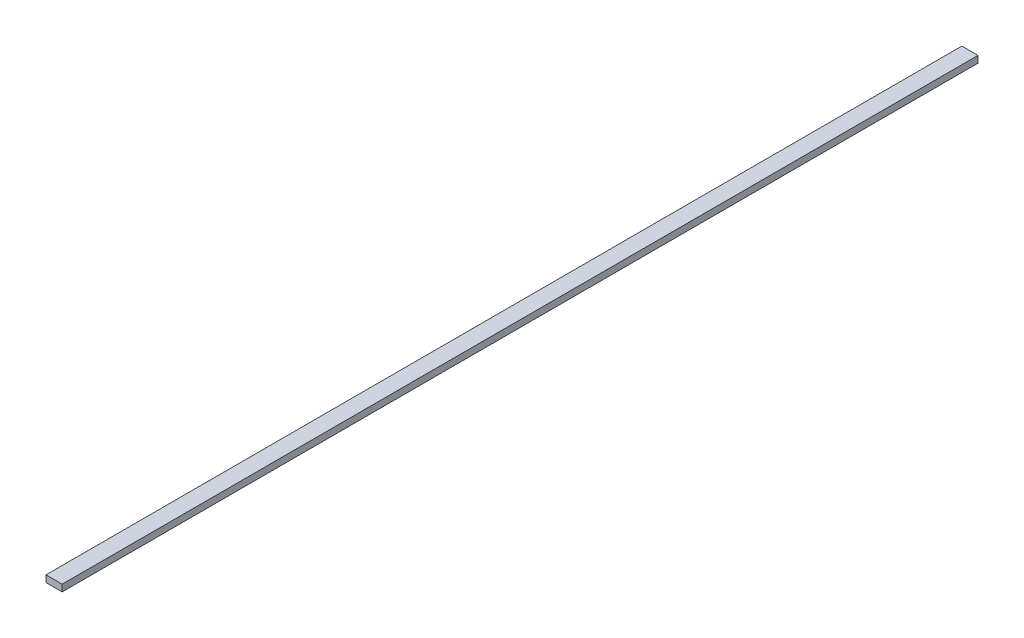
ISO-10303-21;
HEADER;
FILE_DESCRIPTION(('STEP AP214'),'2;1');
FILE_NAME('part.step','',(''),(''),'','','');
FILE_SCHEMA(('AUTOMOTIVE_DESIGN { 1 0 10303 214 1 1 1 1 }'));
ENDSEC;
DATA;
#1=APPLICATION_CONTEXT('core data for automotive mechanical design processes');
#2=APPLICATION_PROTOCOL_DEFINITION('international standard','automotive_design',2000,#1);
#3=PRODUCT_CONTEXT('',#1,'mechanical');
#4=PRODUCT('Part','Part','',(#3));
#5=PRODUCT_RELATED_PRODUCT_CATEGORY('part','',(#4));
#6=PRODUCT_DEFINITION_FORMATION('','',#4);
#7=PRODUCT_DEFINITION_CONTEXT('part definition',#1,'design');
#8=PRODUCT_DEFINITION('design','',#6,#7);
#9=PRODUCT_DEFINITION_SHAPE('','',#8);
#10=(LENGTH_UNIT() NAMED_UNIT(*) SI_UNIT(.MILLI.,.METRE.));
#11=(NAMED_UNIT(*) PLANE_ANGLE_UNIT() SI_UNIT($,.RADIAN.));
#12=(NAMED_UNIT(*) SI_UNIT($,.STERADIAN.) SOLID_ANGLE_UNIT());
#13=UNCERTAINTY_MEASURE_WITH_UNIT(LENGTH_MEASURE(1.E-05),#10,'distance_accuracy_value','');
#14=(GEOMETRIC_REPRESENTATION_CONTEXT(3) GLOBAL_UNCERTAINTY_ASSIGNED_CONTEXT((#13)) GLOBAL_UNIT_ASSIGNED_CONTEXT((#10,
#11,#12)) REPRESENTATION_CONTEXT('',''));
#15=CARTESIAN_POINT('',(0.,0.,0.));
#16=DIRECTION('',(0.,0.,1.));
#17=DIRECTION('',(1.,0.,0.));
#18=AXIS2_PLACEMENT_3D('',#15,#16,#17);
#19=CARTESIAN_POINT('',(0.,0.,680.));
#20=DIRECTION('',(1.,0.,0.));
#21=DIRECTION('',(0.,0.,-1.));
#22=AXIS2_PLACEMENT_3D('',#19,#20,#21);
#23=PLANE('',#22);
#24=DIRECTION('',(0.,-1.,0.));
#25=VECTOR('',#24,1.);
#26=CARTESIAN_POINT('',(0.,0.,0.));
#27=LINE('',#26,#25);
#28=CARTESIAN_POINT('',(0.,5.,0.));
#29=VERTEX_POINT('',#28);
#30=CARTESIAN_POINT('',(0.,0.,0.));
#31=VERTEX_POINT('',#30);
#32=EDGE_CURVE('E96',#29,#31,#27,.T.);
#33=ORIENTED_EDGE('',*,*,#32,.T.);
#34=DIRECTION('',(0.,0.,-1.));
#35=VECTOR('',#34,1.);
#36=CARTESIAN_POINT('',(0.,0.,680.));
#37=LINE('',#36,#35);
#38=CARTESIAN_POINT('',(0.,0.,680.));
#39=VERTEX_POINT('',#38);
#40=EDGE_CURVE('E11',#39,#31,#37,.T.);
#41=ORIENTED_EDGE('',*,*,#40,.F.);
#42=DIRECTION('',(0.,-1.,0.));
#43=VECTOR('',#42,1.);
#44=CARTESIAN_POINT('',(0.,0.,680.));
#45=LINE('',#44,#43);
#46=CARTESIAN_POINT('',(0.,5.,680.));
#47=VERTEX_POINT('',#46);
#48=EDGE_CURVE('E84',#47,#39,#45,.T.);
#49=ORIENTED_EDGE('',*,*,#48,.F.);
#50=DIRECTION('',(0.,0.,-1.));
#51=VECTOR('',#50,1.);
#52=CARTESIAN_POINT('',(0.,5.,680.));
#53=LINE('',#52,#51);
#54=EDGE_CURVE('E92',#47,#29,#53,.T.);
#55=ORIENTED_EDGE('',*,*,#54,.T.);
#56=EDGE_LOOP('',(#33,#41,#49,#55));
#57=FACE_BOUND('',#56,.T.);
#58=ADVANCED_FACE('F33',(#57),#23,.F.);
#59=CARTESIAN_POINT('',(0.,0.,680.));
#60=DIRECTION('',(0.,1.,0.));
#61=DIRECTION('',(0.,0.,1.));
#62=AXIS2_PLACEMENT_3D('',#59,#60,#61);
#63=PLANE('',#62);
#64=DIRECTION('',(1.,0.,0.));
#65=VECTOR('',#64,1.);
#66=CARTESIAN_POINT('',(0.,0.,0.));
#67=LINE('',#66,#65);
#68=CARTESIAN_POINT('',(12.,0.,0.));
#69=VERTEX_POINT('',#68);
#70=EDGE_CURVE('E88',#31,#69,#67,.T.);
#71=ORIENTED_EDGE('',*,*,#70,.T.);
#72=DIRECTION('',(0.,0.,-1.));
#73=VECTOR('',#72,1.);
#74=CARTESIAN_POINT('',(12.,0.,680.));
#75=LINE('',#74,#73);
#76=CARTESIAN_POINT('',(12.,0.,680.));
#77=VERTEX_POINT('',#76);
#78=EDGE_CURVE('E41',#77,#69,#75,.T.);
#79=ORIENTED_EDGE('',*,*,#78,.F.);
#80=DIRECTION('',(1.,0.,0.));
#81=VECTOR('',#80,1.);
#82=CARTESIAN_POINT('',(0.,0.,680.));
#83=LINE('',#82,#81);
#84=EDGE_CURVE('E79',#39,#77,#83,.T.);
#85=ORIENTED_EDGE('',*,*,#84,.F.);
#86=ORIENTED_EDGE('',*,*,#40,.T.);
#87=EDGE_LOOP('',(#71,#79,#85,#86));
#88=FACE_BOUND('',#87,.T.);
#89=ADVANCED_FACE('F87',(#88),#63,.F.);
#90=CARTESIAN_POINT('',(12.,0.,680.));
#91=DIRECTION('',(-1.,0.,0.));
#92=DIRECTION('',(0.,0.,1.));
#93=AXIS2_PLACEMENT_3D('',#90,#91,#92);
#94=PLANE('',#93);
#95=DIRECTION('',(0.,1.,0.));
#96=VECTOR('',#95,1.);
#97=CARTESIAN_POINT('',(12.,0.,0.));
#98=LINE('',#97,#96);
#99=CARTESIAN_POINT('',(12.,5.,0.));
#100=VERTEX_POINT('',#99);
#101=EDGE_CURVE('E66',#69,#100,#98,.T.);
#102=ORIENTED_EDGE('',*,*,#101,.T.);
#103=DIRECTION('',(0.,0.,-1.));
#104=VECTOR('',#103,1.);
#105=CARTESIAN_POINT('',(12.,5.,680.));
#106=LINE('',#105,#104);
#107=CARTESIAN_POINT('',(12.,5.,680.));
#108=VERTEX_POINT('',#107);
#109=EDGE_CURVE('E89',#108,#100,#106,.T.);
#110=ORIENTED_EDGE('',*,*,#109,.F.);
#111=DIRECTION('',(0.,1.,0.));
#112=VECTOR('',#111,1.);
#113=CARTESIAN_POINT('',(12.,0.,680.));
#114=LINE('',#113,#112);
#115=EDGE_CURVE('E82',#77,#108,#114,.T.);
#116=ORIENTED_EDGE('',*,*,#115,.F.);
#117=ORIENTED_EDGE('',*,*,#78,.T.);
#118=EDGE_LOOP('',(#102,#110,#116,#117));
#119=FACE_BOUND('',#118,.T.);
#120=ADVANCED_FACE('F90',(#119),#94,.F.);
#121=CARTESIAN_POINT('',(0.,5.,680.));
#122=DIRECTION('',(0.,-1.,0.));
#123=DIRECTION('',(0.,0.,-1.));
#124=AXIS2_PLACEMENT_3D('',#121,#122,#123);
#125=PLANE('',#124);
#126=DIRECTION('',(-1.,0.,0.));
#127=VECTOR('',#126,1.);
#128=CARTESIAN_POINT('',(0.,5.,0.));
#129=LINE('',#128,#127);
#130=EDGE_CURVE('E72',#100,#29,#129,.T.);
#131=ORIENTED_EDGE('',*,*,#130,.T.);
#132=ORIENTED_EDGE('',*,*,#54,.F.);
#133=DIRECTION('',(-1.,0.,0.));
#134=VECTOR('',#133,1.);
#135=CARTESIAN_POINT('',(0.,5.,680.));
#136=LINE('',#135,#134);
#137=EDGE_CURVE('E49',#108,#47,#136,.T.);
#138=ORIENTED_EDGE('',*,*,#137,.F.);
#139=ORIENTED_EDGE('',*,*,#109,.T.);
#140=EDGE_LOOP('',(#131,#132,#138,#139));
#141=FACE_BOUND('',#140,.T.);
#142=ADVANCED_FACE('F103',(#141),#125,.F.);
#143=CARTESIAN_POINT('',(0.,0.,680.));
#144=DIRECTION('',(0.,0.,-1.));
#145=DIRECTION('',(-1.,0.,0.));
#146=AXIS2_PLACEMENT_3D('',#143,#144,#145);
#147=PLANE('',#146);
#148=ORIENTED_EDGE('',*,*,#48,.T.);
#149=ORIENTED_EDGE('',*,*,#84,.T.);
#150=ORIENTED_EDGE('',*,*,#115,.T.);
#151=ORIENTED_EDGE('',*,*,#137,.T.);
#152=EDGE_LOOP('',(#148,#149,#150,#151));
#153=FACE_BOUND('',#152,.T.);
#154=ADVANCED_FACE('F80',(#153),#147,.F.);
#155=CARTESIAN_POINT('',(0.,0.,0.));
#156=DIRECTION('',(0.,0.,-1.));
#157=DIRECTION('',(-1.,0.,0.));
#158=AXIS2_PLACEMENT_3D('',#155,#156,#157);
#159=PLANE('',#158);
#160=ORIENTED_EDGE('',*,*,#32,.F.);
#161=ORIENTED_EDGE('',*,*,#130,.F.);
#162=ORIENTED_EDGE('',*,*,#101,.F.);
#163=ORIENTED_EDGE('',*,*,#70,.F.);
#164=EDGE_LOOP('',(#160,#161,#162,#163));
#165=FACE_BOUND('',#164,.T.);
#166=ADVANCED_FACE('F106',(#165),#159,.T.);
#167=CLOSED_SHELL('',(#58,#89,#120,#142,#154,#166));
#168=MANIFOLD_SOLID_BREP('B2',#167);
#169=ADVANCED_BREP_SHAPE_REPRESENTATION('',(#18,#168),#14);
#170=SHAPE_DEFINITION_REPRESENTATION(#9,#169);
ENDSEC;
END-ISO-10303-21;
